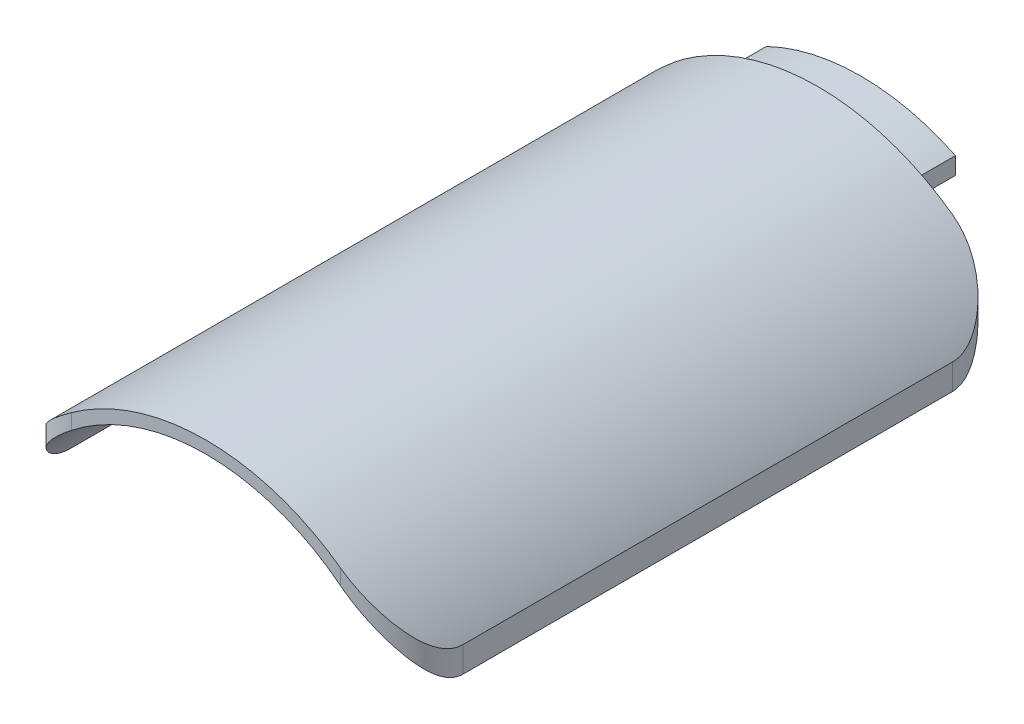
ISO-10303-21;
HEADER;
FILE_DESCRIPTION(('STEP AP214'),'2;1');
FILE_NAME('part.step','',(''),(''),'','','');
FILE_SCHEMA(('AUTOMOTIVE_DESIGN { 1 0 10303 214 1 1 1 1 }'));
ENDSEC;
DATA;
#1=APPLICATION_CONTEXT('core data for automotive mechanical design processes');
#2=APPLICATION_PROTOCOL_DEFINITION('international standard','automotive_design',2000,#1);
#3=PRODUCT_CONTEXT('',#1,'mechanical');
#4=PRODUCT('Part','Part','',(#3));
#5=PRODUCT_RELATED_PRODUCT_CATEGORY('part','',(#4));
#6=PRODUCT_DEFINITION_FORMATION('','',#4);
#7=PRODUCT_DEFINITION_CONTEXT('part definition',#1,'design');
#8=PRODUCT_DEFINITION('design','',#6,#7);
#9=PRODUCT_DEFINITION_SHAPE('','',#8);
#10=(LENGTH_UNIT() NAMED_UNIT(*) SI_UNIT(.MILLI.,.METRE.));
#11=(NAMED_UNIT(*) PLANE_ANGLE_UNIT() SI_UNIT($,.RADIAN.));
#12=(NAMED_UNIT(*) SI_UNIT($,.STERADIAN.) SOLID_ANGLE_UNIT());
#13=UNCERTAINTY_MEASURE_WITH_UNIT(LENGTH_MEASURE(1.E-05),#10,'distance_accuracy_value','');
#14=(GEOMETRIC_REPRESENTATION_CONTEXT(3) GLOBAL_UNCERTAINTY_ASSIGNED_CONTEXT((#13)) GLOBAL_UNIT_ASSIGNED_CONTEXT((#10,
#11,#12)) REPRESENTATION_CONTEXT('',''));
#15=CARTESIAN_POINT('',(0.,0.,0.));
#16=DIRECTION('',(0.,0.,1.));
#17=DIRECTION('',(1.,0.,0.));
#18=AXIS2_PLACEMENT_3D('',#15,#16,#17);
#19=CARTESIAN_POINT('',(0.,0.,375.));
#20=DIRECTION('',(0.,0.,-1.));
#21=DIRECTION('',(-1.,0.,0.));
#22=AXIS2_PLACEMENT_3D('',#19,#20,#21);
#23=CYLINDRICAL_SURFACE('',#22,37.5);
#24=DIRECTION('',(0.,0.,-1.));
#25=VECTOR('',#24,1.);
#26=CARTESIAN_POINT('',(32.,19.5512147960171,375.));
#27=LINE('',#26,#25);
#28=CARTESIAN_POINT('',(32.,19.5512147960171,106.));
#29=VERTEX_POINT('',#28);
#30=CARTESIAN_POINT('',(32.,19.5512147960171,26.));
#31=VERTEX_POINT('',#30);
#32=EDGE_CURVE('E191',#29,#31,#27,.T.);
#33=ORIENTED_EDGE('',*,*,#32,.T.);
#34=CARTESIAN_POINT('',(32.,19.5512147960171,26.));
#35=CARTESIAN_POINT('',(32.0000348606653,19.5511406859725,25.8386052225587));
#36=CARTESIAN_POINT('',(31.9960942535341,19.5576071985785,25.6772548940674));
#37=CARTESIAN_POINT('',(31.9805331520392,19.583051269911,25.3561231325469));
#38=CARTESIAN_POINT('',(31.968922749581,19.6020123881723,25.1963399175093));
#39=CARTESIAN_POINT('',(31.9384813135739,19.6515697083223,24.8813526395979));
#40=CARTESIAN_POINT('',(31.9197413982965,19.6820190466172,24.7261163802708));
#41=CARTESIAN_POINT('',(31.8754646946513,19.7536460253051,24.4190954062567));
#42=CARTESIAN_POINT('',(31.8499253104144,19.7948277629356,24.2673120338695));
#43=CARTESIAN_POINT('',(31.7842201462848,19.9002068748232,23.9245014913258));
#44=CARTESIAN_POINT('',(31.7419605818202,19.9676153626029,23.7348606710974));
#45=CARTESIAN_POINT('',(31.648046999364,20.1161336992894,23.3633431199751));
#46=CARTESIAN_POINT('',(31.5963855319218,20.1972544092065,23.1814726879354));
#47=CARTESIAN_POINT('',(31.4844466779128,20.3713123373272,22.8250439237699));
#48=CARTESIAN_POINT('',(31.4241266687638,20.4643077438852,22.6505276422623));
#49=CARTESIAN_POINT('',(31.2960082281873,20.6597080924699,22.3098310711483));
#50=CARTESIAN_POINT('',(31.2282115846393,20.762110783969,22.1436488024062));
#51=CARTESIAN_POINT('',(31.0411596214151,21.041378965737,21.7174017276407));
#52=CARTESIAN_POINT('',(30.9163316329688,21.2246123216131,21.4639369527733));
#53=CARTESIAN_POINT('',(30.6512580517848,21.605656188603,20.9767852104129));
#54=CARTESIAN_POINT('',(30.511002786363,21.8034758191899,20.7431108155729));
#55=CARTESIAN_POINT('',(30.2165229683374,22.2097905431531,20.2937745601052));
#56=CARTESIAN_POINT('',(30.0622745038168,22.4183036351353,20.0781447906464));
#57=CARTESIAN_POINT('',(29.741203601213,22.8425404415046,19.6642012824933));
#58=CARTESIAN_POINT('',(29.5743824004569,23.0582634451791,19.4658858439701));
#59=CARTESIAN_POINT('',(29.1469523195718,23.5981629886693,18.9953833486541));
#60=CARTESIAN_POINT('',(28.8793964106882,23.9252375210541,18.7327868109242));
#61=CARTESIAN_POINT('',(28.3202795797842,24.5845250716592,18.241616571789));
#62=CARTESIAN_POINT('',(28.0287083181411,24.9167402526255,18.0130576451894));
#63=CARTESIAN_POINT('',(27.4232826277421,25.5815438826687,17.5902383018335));
#64=CARTESIAN_POINT('',(27.109463380802,25.9141309585163,17.3959253549362));
#65=CARTESIAN_POINT('',(26.4602493224489,26.5766861518724,17.0421670380368));
#66=CARTESIAN_POINT('',(26.1248591720081,26.9066548179634,16.8827141681196));
#67=CARTESIAN_POINT('',(25.490143516614,27.5074748434716,16.6236257357688));
#68=CARTESIAN_POINT('',(25.1938714177103,27.7791815159084,16.5184742297731));
#69=CARTESIAN_POINT('',(24.5880635524904,28.3167982924156,16.3355280674058));
#70=CARTESIAN_POINT('',(24.2785322458401,28.5827103007902,16.2577242925699));
#71=CARTESIAN_POINT('',(23.6468917273231,29.1074425593171,16.1312827009771));
#72=CARTESIAN_POINT('',(23.3247664948343,29.3662530134371,16.0826834117591));
#73=CARTESIAN_POINT('',(22.8336750184276,29.7475438042224,16.0334511027046));
#74=CARTESIAN_POINT('',(22.6685651395805,29.8735557669414,16.0209844280461));
#75=CARTESIAN_POINT('',(22.3359859847857,30.1230306201399,16.0042595775438));
#76=CARTESIAN_POINT('',(22.1685163777263,30.2464931467736,16.0000025654507));
#77=CARTESIAN_POINT('',(22.,30.3685692781204,16.));
#78=B_SPLINE_CURVE_WITH_KNOTS('',3,(#34,#35,#36,#37,#38,#39,#40,#41,#42,#43,#44,#45,#46,#47,#48,
#49,#50,#51,#52,#53,#54,#55,#56,#57,#58,#59,#60,#61,#62,#63,#64,#65,#66,#67,#68,#69,#70,#71,#72,
#73,#74,#75,#76,#77),.UNSPECIFIED.,.F.,.F.,(4,2,2,2,2,2,2,2,2,2,2,2,2,2,2,2,2,2,2,2,2,4),(0.,
0.483935807476874,0.967236117867529,1.44455655651209,1.92205948626233,2.53805851832963,
3.15454776952646,3.77418302963144,4.39367043702188,5.40229644344911,6.41155848822273,
7.42257889448323,8.4334999322682,9.92403076524386,11.4152067231809,12.9040750623484,
14.3926227654229,15.6381118942458,16.8831853488944,18.1298977607866,18.7539589927139,
19.3781086811744),.UNSPECIFIED.);
#79=CARTESIAN_POINT('',(22.,30.3685692781204,16.));
#80=VERTEX_POINT('',#79);
#81=EDGE_CURVE('E262',#31,#80,#78,.T.);
#82=ORIENTED_EDGE('',*,*,#81,.T.);
#83=CARTESIAN_POINT('',(0.,0.,16.));
#84=DIRECTION('',(0.,0.,1.));
#85=DIRECTION('',(1.,0.,0.));
#86=AXIS2_PLACEMENT_3D('',#83,#84,#85);
#87=CIRCLE('',#86,37.5);
#88=CARTESIAN_POINT('',(-22.,30.3685692781204,16.));
#89=VERTEX_POINT('',#88);
#90=EDGE_CURVE('E188',#80,#89,#87,.T.);
#91=ORIENTED_EDGE('',*,*,#90,.T.);
#92=CARTESIAN_POINT('',(-22.,30.3685692781204,16.));
#93=CARTESIAN_POINT('',(-22.1721835225826,30.2438367623664,16.0000028145737));
#94=CARTESIAN_POINT('',(-22.343273233468,30.117657347922,16.0044469752308));
#95=CARTESIAN_POINT('',(-22.6829817924161,29.8626424041903,16.0219003638456));
#96=CARTESIAN_POINT('',(-22.85160100365,29.7338072721419,16.0349083197188));
#97=CARTESIAN_POINT('',(-23.3530346536469,29.3439059859976,16.0862657618297));
#98=CARTESIAN_POINT('',(-23.6818068244252,29.079167267938,16.1369502498168));
#99=CARTESIAN_POINT('',(-24.3257690667173,28.54263986711,16.2686797454599));
#100=CARTESIAN_POINT('',(-24.6409900684579,28.2708697866179,16.3496510170919));
#101=CARTESIAN_POINT('',(-25.2575379628479,27.7214234359218,16.5399495337641));
#102=CARTESIAN_POINT('',(-25.5588611146832,27.4437456046101,16.6492843614219));
#103=CARTESIAN_POINT('',(-26.1592581585075,26.8723334747862,16.899948006835));
#104=CARTESIAN_POINT('',(-26.4576720727544,26.5784238818279,17.0424552932412));
#105=CARTESIAN_POINT('',(-27.0373892922903,25.9884707339961,17.3551639111054));
#106=CARTESIAN_POINT('',(-27.3186919450032,25.6924270982171,17.5253662978693));
#107=CARTESIAN_POINT('',(-27.8637995398078,25.1002164029748,17.8929605523654));
#108=CARTESIAN_POINT('',(-28.1275800689398,24.8040497268011,18.0903892231313));
#109=CARTESIAN_POINT('',(-28.636380785587,24.2148522211638,18.5121660757309));
#110=CARTESIAN_POINT('',(-28.8814052345768,23.9218206924726,18.7365081127985));
#111=CARTESIAN_POINT('',(-29.2924847809544,23.4153451606955,19.152930058555));
#112=CARTESIAN_POINT('',(-29.462899994332,23.2004233636663,19.33892951735));
#113=CARTESIAN_POINT('',(-29.792040466365,22.7762232190913,19.7271309611902));
#114=CARTESIAN_POINT('',(-29.9507649177993,22.5669452618714,19.9293340630521));
#115=CARTESIAN_POINT('',(-30.2553452833126,22.1569219083094,20.3505126820212));
#116=CARTESIAN_POINT('',(-30.401223121708,21.9561622902939,20.5694583836154));
#117=CARTESIAN_POINT('',(-30.679104948441,21.5661713210999,21.025620038565));
#118=CARTESIAN_POINT('',(-30.8111153622652,21.3769346479903,21.262827441262));
#119=CARTESIAN_POINT('',(-31.0134853770194,21.0815778934021,21.6655603529876));
#120=CARTESIAN_POINT('',(-31.0885855896759,20.9706079567822,21.8251403388256));
#121=CARTESIAN_POINT('',(-31.2319167481295,20.756541339428,22.1524414393715));
#122=CARTESIAN_POINT('',(-31.3001461404199,20.6534464405226,22.3201643825703));
#123=CARTESIAN_POINT('',(-31.4932689462162,20.3587518313208,22.8358021905933));
#124=CARTESIAN_POINT('',(-31.6069064242812,20.1812858759839,23.1967875628449));
#125=CARTESIAN_POINT('',(-31.7377290341667,19.9742673664052,23.7197755801866));
#126=CARTESIAN_POINT('',(-31.7713972129195,19.920633886837,23.8684444663621));
#127=CARTESIAN_POINT('',(-31.8323653599278,19.8230623002211,24.1701803904557));
#128=CARTESIAN_POINT('',(-31.8596686033829,19.7791192074308,24.3232451206606));
#129=CARTESIAN_POINT('',(-31.9073323154914,19.7021370258921,24.6327977891897));
#130=CARTESIAN_POINT('',(-31.9277078696306,19.6690742496716,24.7892774895195));
#131=CARTESIAN_POINT('',(-31.9611300409407,19.614718724795,25.1049859170745));
#132=CARTESIAN_POINT('',(-31.9741809981529,19.5934190062976,25.2642129586402));
#133=CARTESIAN_POINT('',(-31.9889231944308,19.5693357210882,25.5198015420708));
#134=CARTESIAN_POINT('',(-31.9930724630663,19.5625499629917,25.6156645677162));
#135=CARTESIAN_POINT('',(-31.9986125214682,19.5534857875933,25.8076800079534));
#136=CARTESIAN_POINT('',(-32.0000033813456,19.5512072557307,25.9038324151278));
#137=CARTESIAN_POINT('',(-32.,19.5512147960172,26.));
#138=B_SPLINE_CURVE_WITH_KNOTS('',3,(#92,#93,#94,#95,#96,#97,#98,#99,#100,#101,#102,#103,#104,
#105,#106,#107,#108,#109,#110,#111,#112,#113,#114,#115,#116,#117,#118,#119,#120,#121,#122,#123,
#124,#125,#126,#127,#128,#129,#130,#131,#132,#133,#134,#135,#136,#137),.UNSPECIFIED.,.F.,.F.,(4,
2,2,2,2,2,2,2,2,2,2,2,2,2,2,2,2,2,2,2,2,2,4),(0.,0.637726243830515,1.27535777980772,
2.54921126487554,3.81998340893068,5.09109562765375,6.41714094110986,7.74323679460103,
9.07114309233862,10.3987467820907,11.3923883557669,12.3860984740029,13.3780784380731,
14.3695967206994,14.9943092855507,15.6191627835429,16.8664385755126,17.3508631641748,
17.8350379299232,18.3181515185684,18.8009785450163,19.0894225796041,19.3778592826748),.UNSPECIFIED.);
#139=CARTESIAN_POINT('',(-32.,19.5512147960172,26.));
#140=VERTEX_POINT('',#139);
#141=EDGE_CURVE('E302',#89,#140,#138,.T.);
#142=ORIENTED_EDGE('',*,*,#141,.T.);
#143=DIRECTION('',(0.,0.,-1.));
#144=VECTOR('',#143,1.);
#145=CARTESIAN_POINT('',(-32.,19.5512147960172,375.));
#146=LINE('',#145,#144);
#147=CARTESIAN_POINT('',(-32.,19.5512147960172,106.));
#148=VERTEX_POINT('',#147);
#149=EDGE_CURVE('E194',#140,#148,#146,.F.);
#150=ORIENTED_EDGE('',*,*,#149,.T.);
#151=CARTESIAN_POINT('',(-32.,19.5512147960172,106.));
#152=CARTESIAN_POINT('',(-32.0000348606653,19.5511406859726,106.161394777441));
#153=CARTESIAN_POINT('',(-31.9960942535341,19.5576071985785,106.322745105933));
#154=CARTESIAN_POINT('',(-31.9805331520392,19.583051269911,106.643876867453));
#155=CARTESIAN_POINT('',(-31.968922749581,19.6020123881724,106.803660082491));
#156=CARTESIAN_POINT('',(-31.9384813135738,19.6515697083223,107.118647360402));
#157=CARTESIAN_POINT('',(-31.9197413982965,19.6820190466172,107.273883619729));
#158=CARTESIAN_POINT('',(-31.8754646946513,19.7536460253051,107.580904593743));
#159=CARTESIAN_POINT('',(-31.8499253104144,19.7948277629356,107.73268796613));
#160=CARTESIAN_POINT('',(-31.7842201462848,19.9002068748232,108.075498508674));
#161=CARTESIAN_POINT('',(-31.7419605818202,19.9676153626029,108.265139328903));
#162=CARTESIAN_POINT('',(-31.648046999364,20.1161336992894,108.636656880025));
#163=CARTESIAN_POINT('',(-31.5963855319217,20.1972544092065,108.818527312065));
#164=CARTESIAN_POINT('',(-31.4844466779128,20.3713123373272,109.17495607623));
#165=CARTESIAN_POINT('',(-31.4241266687638,20.4643077438852,109.349472357738));
#166=CARTESIAN_POINT('',(-31.2960082281873,20.6597080924699,109.690168928852));
#167=CARTESIAN_POINT('',(-31.2282115846392,20.7621107839691,109.856351197594));
#168=CARTESIAN_POINT('',(-31.0411596214151,21.041378965737,110.282598272359));
#169=CARTESIAN_POINT('',(-30.9163316329687,21.2246123216131,110.536063047227));
#170=CARTESIAN_POINT('',(-30.6512580517848,21.6056561886031,111.023214789587));
#171=CARTESIAN_POINT('',(-30.5110027863629,21.80347581919,111.256889184427));
#172=CARTESIAN_POINT('',(-30.2165229683373,22.2097905431531,111.706225439895));
#173=CARTESIAN_POINT('',(-30.0622745038168,22.4183036351353,111.921855209354));
#174=CARTESIAN_POINT('',(-29.741203601213,22.8425404415046,112.335798717507));
#175=CARTESIAN_POINT('',(-29.5743824004569,23.0582634451791,112.53411415603));
#176=CARTESIAN_POINT('',(-29.1469523195717,23.5981629886694,113.004616651346));
#177=CARTESIAN_POINT('',(-28.8793964106882,23.9252375210542,113.267213189076));
#178=CARTESIAN_POINT('',(-28.3202795797841,24.5845250716592,113.758383428211));
#179=CARTESIAN_POINT('',(-28.0287083181411,24.9167402526255,113.986942354811));
#180=CARTESIAN_POINT('',(-27.423282627742,25.5815438826688,114.409761698167));
#181=CARTESIAN_POINT('',(-27.109463380802,25.9141309585164,114.604074645064));
#182=CARTESIAN_POINT('',(-26.4602493224488,26.5766861518725,114.957832961963));
#183=CARTESIAN_POINT('',(-26.124859172008,26.9066548179635,115.11728583188));
#184=CARTESIAN_POINT('',(-25.490143516614,27.5074748434717,115.376374264231));
#185=CARTESIAN_POINT('',(-25.1938714177103,27.7791815159084,115.481525770227));
#186=CARTESIAN_POINT('',(-24.5880635524904,28.3167982924156,115.664471932594));
#187=CARTESIAN_POINT('',(-24.27853224584,28.5827103007902,115.74227570743));
#188=CARTESIAN_POINT('',(-23.646891727323,29.1074425593171,115.868717299023));
#189=CARTESIAN_POINT('',(-23.3247664948343,29.3662530134371,115.917316588241));
#190=CARTESIAN_POINT('',(-22.8336750184276,29.7475438042224,115.966548897295));
#191=CARTESIAN_POINT('',(-22.6685651395805,29.8735557669414,115.979015571954));
#192=CARTESIAN_POINT('',(-22.3359859847857,30.1230306201399,115.995740422456));
#193=CARTESIAN_POINT('',(-22.1685163777263,30.2464931467736,115.999997434549));
#194=CARTESIAN_POINT('',(-22.,30.3685692781204,116.));
#195=B_SPLINE_CURVE_WITH_KNOTS('',3,(#151,#152,#153,#154,#155,#156,#157,#158,#159,#160,#161,
#162,#163,#164,#165,#166,#167,#168,#169,#170,#171,#172,#173,#174,#175,#176,#177,#178,#179,#180,
#181,#182,#183,#184,#185,#186,#187,#188,#189,#190,#191,#192,#193,#194),.UNSPECIFIED.,.F.,.F.,(4,
2,2,2,2,2,2,2,2,2,2,2,2,2,2,2,2,2,2,2,2,4),(0.,0.483935807476907,0.967236117867538,
1.44455655651207,1.92205948626233,2.53805851832963,3.15454776952646,3.77418302963145,
4.39367043702188,5.40229644344913,6.41155848822275,7.42257889448326,8.43349993226823,
9.92403076524388,11.415206723181,12.9040750623485,14.3926227654229,15.6381118942458,
16.8831853488944,18.1298977607866,18.7539589927139,19.3781086811744),.UNSPECIFIED.);
#196=CARTESIAN_POINT('',(-22.,30.3685692781204,116.));
#197=VERTEX_POINT('',#196);
#198=EDGE_CURVE('E263',#148,#197,#195,.T.);
#199=ORIENTED_EDGE('',*,*,#198,.T.);
#200=CARTESIAN_POINT('',(0.,0.,116.));
#201=DIRECTION('',(0.,0.,-1.));
#202=DIRECTION('',(-1.,0.,0.));
#203=AXIS2_PLACEMENT_3D('',#200,#201,#202);
#204=CIRCLE('',#203,37.5);
#205=CARTESIAN_POINT('',(22.,30.3685692781204,116.));
#206=VERTEX_POINT('',#205);
#207=EDGE_CURVE('E192',#197,#206,#204,.T.);
#208=ORIENTED_EDGE('',*,*,#207,.T.);
#209=CARTESIAN_POINT('',(22.,30.3685692781204,116.));
#210=CARTESIAN_POINT('',(22.1721835225826,30.2438367623664,115.999997185426));
#211=CARTESIAN_POINT('',(22.343273233468,30.117657347922,115.995553024769));
#212=CARTESIAN_POINT('',(22.6829817924161,29.8626424041903,115.978099636154));
#213=CARTESIAN_POINT('',(22.8516010036501,29.7338072721418,115.965091680281));
#214=CARTESIAN_POINT('',(23.3530346536469,29.3439059859976,115.91373423817));
#215=CARTESIAN_POINT('',(23.6818068244252,29.079167267938,115.863049750183));
#216=CARTESIAN_POINT('',(24.3257690667173,28.54263986711,115.73132025454));
#217=CARTESIAN_POINT('',(24.640990068458,28.2708697866179,115.650348982908));
#218=CARTESIAN_POINT('',(25.2575379628479,27.7214234359218,115.460050466236));
#219=CARTESIAN_POINT('',(25.5588611146832,27.44374560461,115.350715638578));
#220=CARTESIAN_POINT('',(26.1592581585075,26.8723334747862,115.100051993165));
#221=CARTESIAN_POINT('',(26.4576720727544,26.5784238818279,114.957544706759));
#222=CARTESIAN_POINT('',(27.0373892922903,25.9884707339961,114.644836088895));
#223=CARTESIAN_POINT('',(27.3186919450032,25.6924270982171,114.474633702131));
#224=CARTESIAN_POINT('',(27.8637995398078,25.1002164029748,114.107039447635));
#225=CARTESIAN_POINT('',(28.1275800689398,24.8040497268011,113.909610776869));
#226=CARTESIAN_POINT('',(28.636380785587,24.2148522211638,113.487833924269));
#227=CARTESIAN_POINT('',(28.8814052345768,23.9218206924726,113.263491887202));
#228=CARTESIAN_POINT('',(29.2924847809545,23.4153451606955,112.847069941445));
#229=CARTESIAN_POINT('',(29.462899994332,23.2004233636663,112.66107048265));
#230=CARTESIAN_POINT('',(29.792040466365,22.7762232190913,112.27286903881));
#231=CARTESIAN_POINT('',(29.9507649177993,22.5669452618713,112.070665936948));
#232=CARTESIAN_POINT('',(30.2553452833126,22.1569219083094,111.649487317979));
#233=CARTESIAN_POINT('',(30.401223121708,21.9561622902938,111.430541616385));
#234=CARTESIAN_POINT('',(30.679104948441,21.5661713210999,110.974379961435));
#235=CARTESIAN_POINT('',(30.8111153622652,21.3769346479902,110.737172558738));
#236=CARTESIAN_POINT('',(31.0134853770194,21.0815778934021,110.334439647012));
#237=CARTESIAN_POINT('',(31.0885855896759,20.9706079567822,110.174859661174));
#238=CARTESIAN_POINT('',(31.2319167481295,20.756541339428,109.847558560628));
#239=CARTESIAN_POINT('',(31.3001461404199,20.6534464405226,109.67983561743));
#240=CARTESIAN_POINT('',(31.4932689462162,20.3587518313207,109.164197809407));
#241=CARTESIAN_POINT('',(31.6069064242812,20.1812858759839,108.803212437155));
#242=CARTESIAN_POINT('',(31.7377290341667,19.9742673664051,108.280224419813));
#243=CARTESIAN_POINT('',(31.7713972129195,19.920633886837,108.131555533638));
#244=CARTESIAN_POINT('',(31.8323653599279,19.8230623002211,107.829819609544));
#245=CARTESIAN_POINT('',(31.859668603383,19.7791192074308,107.676754879339));
#246=CARTESIAN_POINT('',(31.9073323154914,19.7021370258921,107.36720221081));
#247=CARTESIAN_POINT('',(31.9277078696306,19.6690742496716,107.210722510481));
#248=CARTESIAN_POINT('',(31.9611300409407,19.614718724795,106.895014082925));
#249=CARTESIAN_POINT('',(31.9741809981529,19.5934190062975,106.73578704136));
#250=CARTESIAN_POINT('',(31.9889231944308,19.5693357210882,106.480198457929));
#251=CARTESIAN_POINT('',(31.9930724630663,19.5625499629916,106.384335432284));
#252=CARTESIAN_POINT('',(31.9986125214683,19.5534857875932,106.192319992047));
#253=CARTESIAN_POINT('',(32.0000033813456,19.5512072557306,106.096167584872));
#254=CARTESIAN_POINT('',(32.,19.5512147960171,106.));
#255=B_SPLINE_CURVE_WITH_KNOTS('',3,(#209,#210,#211,#212,#213,#214,#215,#216,#217,#218,#219,
#220,#221,#222,#223,#224,#225,#226,#227,#228,#229,#230,#231,#232,#233,#234,#235,#236,#237,#238,
#239,#240,#241,#242,#243,#244,#245,#246,#247,#248,#249,#250,#251,#252,#253,#254),.UNSPECIFIED.,
.F.,.F.,(4,2,2,2,2,2,2,2,2,2,2,2,2,2,2,2,2,2,2,2,2,2,4),(0.,0.637726243830516,1.27535777980772,
2.54921126487555,3.81998340893068,5.09109562765375,6.41714094110986,7.74323679460103,
9.07114309233862,10.3987467820907,11.3923883557669,12.3860984740029,13.3780784380731,
14.3695967206994,14.9943092855507,15.6191627835429,16.8664385755126,17.3508631641748,
17.8350379299232,18.3181515185684,18.8009785450163,19.0894225796041,19.3778592826749),.UNSPECIFIED.);
#256=EDGE_CURVE('E255',#206,#29,#255,.T.);
#257=ORIENTED_EDGE('',*,*,#256,.T.);
#258=EDGE_LOOP('',(#33,#82,#91,#142,#150,#199,#208,#257));
#259=FACE_BOUND('',#258,.T.);
#260=ADVANCED_FACE('F33',(#259),#23,.T.);
#261=CARTESIAN_POINT('',(-32.,49.0499971602689,16.));
#262=DIRECTION('',(1.,0.,0.));
#263=DIRECTION('',(0.,0.,-1.));
#264=AXIS2_PLACEMENT_3D('',#261,#262,#263);
#265=PLANE('',#264);
#266=DIRECTION('',(0.,0.,-1.));
#267=VECTOR('',#266,1.);
#268=CARTESIAN_POINT('',(-32.,15.3704261489395,375.));
#269=LINE('',#268,#267);
#270=CARTESIAN_POINT('',(-32.,15.3704261489395,26.));
#271=VERTEX_POINT('',#270);
#272=CARTESIAN_POINT('',(-32.,15.3704261489395,106.));
#273=VERTEX_POINT('',#272);
#274=EDGE_CURVE('E185',#271,#273,#269,.F.);
#275=ORIENTED_EDGE('',*,*,#274,.T.);
#276=DIRECTION('',(0.,-1.,0.));
#277=VECTOR('',#276,1.);
#278=CARTESIAN_POINT('',(-32.,49.0499971602689,106.));
#279=LINE('',#278,#277);
#280=EDGE_CURVE('E11',#273,#148,#279,.F.);
#281=ORIENTED_EDGE('',*,*,#280,.T.);
#282=ORIENTED_EDGE('',*,*,#149,.F.);
#283=DIRECTION('',(0.,-1.,0.));
#284=VECTOR('',#283,1.);
#285=CARTESIAN_POINT('',(-32.,49.0499971602689,26.));
#286=LINE('',#285,#284);
#287=EDGE_CURVE('E42',#140,#271,#286,.T.);
#288=ORIENTED_EDGE('',*,*,#287,.T.);
#289=EDGE_LOOP('',(#275,#281,#282,#288));
#290=FACE_BOUND('',#289,.T.);
#291=ADVANCED_FACE('F226',(#290),#265,.F.);
#292=CARTESIAN_POINT('',(-32.,49.0499971602689,116.));
#293=DIRECTION('',(0.,0.,-1.));
#294=DIRECTION('',(-1.,0.,0.));
#295=AXIS2_PLACEMENT_3D('',#292,#293,#294);
#296=PLANE('',#295);
#297=CARTESIAN_POINT('',(0.,0.,116.));
#298=DIRECTION('',(0.,0.,-1.));
#299=DIRECTION('',(-1.,0.,0.));
#300=AXIS2_PLACEMENT_3D('',#297,#298,#299);
#301=CIRCLE('',#300,35.5);
#302=CARTESIAN_POINT('',(-22.,27.8612634315101,116.));
#303=VERTEX_POINT('',#302);
#304=CARTESIAN_POINT('',(22.,27.8612634315101,116.));
#305=VERTEX_POINT('',#304);
#306=EDGE_CURVE('E183',#303,#305,#301,.T.);
#307=ORIENTED_EDGE('',*,*,#306,.T.);
#308=DIRECTION('',(0.,-1.,0.));
#309=VECTOR('',#308,1.);
#310=CARTESIAN_POINT('',(22.,49.0499971602689,116.));
#311=LINE('',#310,#309);
#312=EDGE_CURVE('E57',#305,#206,#311,.F.);
#313=ORIENTED_EDGE('',*,*,#312,.T.);
#314=ORIENTED_EDGE('',*,*,#207,.F.);
#315=DIRECTION('',(0.,-1.,0.));
#316=VECTOR('',#315,1.);
#317=CARTESIAN_POINT('',(-22.,49.0499971602689,116.));
#318=LINE('',#317,#316);
#319=EDGE_CURVE('E274',#197,#303,#318,.T.);
#320=ORIENTED_EDGE('',*,*,#319,.T.);
#321=EDGE_LOOP('',(#307,#313,#314,#320));
#322=FACE_BOUND('',#321,.T.);
#323=ADVANCED_FACE('F292',(#322),#296,.F.);
#324=CARTESIAN_POINT('',(32.,49.0499971602689,16.));
#325=DIRECTION('',(-1.,0.,0.));
#326=DIRECTION('',(0.,0.,1.));
#327=AXIS2_PLACEMENT_3D('',#324,#325,#326);
#328=PLANE('',#327);
#329=DIRECTION('',(0.,0.,-1.));
#330=VECTOR('',#329,1.);
#331=CARTESIAN_POINT('',(32.,15.3704261489393,375.));
#332=LINE('',#331,#330);
#333=CARTESIAN_POINT('',(32.,15.3704261489393,106.));
#334=VERTEX_POINT('',#333);
#335=CARTESIAN_POINT('',(32.,15.3704261489393,26.));
#336=VERTEX_POINT('',#335);
#337=EDGE_CURVE('E180',#334,#336,#332,.T.);
#338=ORIENTED_EDGE('',*,*,#337,.T.);
#339=DIRECTION('',(0.,-1.,0.));
#340=VECTOR('',#339,1.);
#341=CARTESIAN_POINT('',(32.,49.0499971602689,26.));
#342=LINE('',#341,#340);
#343=EDGE_CURVE('E301',#336,#31,#342,.F.);
#344=ORIENTED_EDGE('',*,*,#343,.T.);
#345=ORIENTED_EDGE('',*,*,#32,.F.);
#346=DIRECTION('',(0.,-1.,0.));
#347=VECTOR('',#346,1.);
#348=CARTESIAN_POINT('',(32.,49.0499971602689,106.));
#349=LINE('',#348,#347);
#350=EDGE_CURVE('E298',#29,#334,#349,.T.);
#351=ORIENTED_EDGE('',*,*,#350,.T.);
#352=EDGE_LOOP('',(#338,#344,#345,#351));
#353=FACE_BOUND('',#352,.T.);
#354=ADVANCED_FACE('F320',(#353),#328,.F.);
#355=CARTESIAN_POINT('',(-32.,49.0499971602689,16.));
#356=DIRECTION('',(0.,0.,1.));
#357=DIRECTION('',(1.,0.,0.));
#358=AXIS2_PLACEMENT_3D('',#355,#356,#357);
#359=PLANE('',#358);
#360=ORIENTED_EDGE('',*,*,#90,.F.);
#361=DIRECTION('',(0.,-1.,0.));
#362=VECTOR('',#361,1.);
#363=CARTESIAN_POINT('',(22.,49.0499971602689,16.));
#364=LINE('',#363,#362);
#365=CARTESIAN_POINT('',(22.,27.8612634315101,16.));
#366=VERTEX_POINT('',#365);
#367=EDGE_CURVE('E201',#80,#366,#364,.T.);
#368=ORIENTED_EDGE('',*,*,#367,.T.);
#369=CARTESIAN_POINT('',(0.,0.,16.));
#370=DIRECTION('',(0.,0.,1.));
#371=DIRECTION('',(1.,0.,0.));
#372=AXIS2_PLACEMENT_3D('',#369,#370,#371);
#373=CIRCLE('',#372,35.5);
#374=CARTESIAN_POINT('',(15.4507042253521,31.9613162892376,16.));
#375=VERTEX_POINT('',#374);
#376=EDGE_CURVE('E177',#366,#375,#373,.T.);
#377=ORIENTED_EDGE('',*,*,#376,.T.);
#378=CARTESIAN_POINT('',(-15.4507042253521,31.9613162892376,16.));
#379=VERTEX_POINT('',#378);
#380=EDGE_CURVE('E137',#375,#379,#373,.T.);
#381=ORIENTED_EDGE('',*,*,#380,.T.);
#382=CARTESIAN_POINT('',(-22.,27.8612634315101,16.));
#383=VERTEX_POINT('',#382);
#384=EDGE_CURVE('E172',#379,#383,#373,.T.);
#385=ORIENTED_EDGE('',*,*,#384,.T.);
#386=DIRECTION('',(0.,-1.,0.));
#387=VECTOR('',#386,1.);
#388=CARTESIAN_POINT('',(-22.,49.0499971602689,16.));
#389=LINE('',#388,#387);
#390=EDGE_CURVE('E199',#383,#89,#389,.F.);
#391=ORIENTED_EDGE('',*,*,#390,.T.);
#392=EDGE_LOOP('',(#360,#368,#377,#381,#385,#391));
#393=FACE_BOUND('',#392,.T.);
#394=ADVANCED_FACE('F224',(#393),#359,.F.);
#395=CARTESIAN_POINT('',(0.,0.,375.));
#396=DIRECTION('',(0.,0.,-1.));
#397=DIRECTION('',(-1.,0.,0.));
#398=AXIS2_PLACEMENT_3D('',#395,#396,#397);
#399=CYLINDRICAL_SURFACE('',#398,35.5);
#400=DIRECTION('',(0.,0.,-1.));
#401=VECTOR('',#400,1.);
#402=CARTESIAN_POINT('',(-15.4507042253521,31.9613162892376,26.));
#403=LINE('',#402,#401);
#404=CARTESIAN_POINT('',(-15.4507042253521,31.9613162892376,26.));
#405=VERTEX_POINT('',#404);
#406=EDGE_CURVE('E169',#405,#379,#403,.T.);
#407=ORIENTED_EDGE('',*,*,#406,.F.);
#408=CARTESIAN_POINT('',(0.,0.,26.));
#409=DIRECTION('',(0.,0.,-1.));
#410=DIRECTION('',(-1.,0.,0.));
#411=AXIS2_PLACEMENT_3D('',#408,#409,#410);
#412=CIRCLE('',#411,35.5);
#413=CARTESIAN_POINT('',(15.4507042253521,31.9613162892376,26.));
#414=VERTEX_POINT('',#413);
#415=EDGE_CURVE('E160',#405,#414,#412,.T.);
#416=ORIENTED_EDGE('',*,*,#415,.T.);
#417=DIRECTION('',(0.,0.,-1.));
#418=VECTOR('',#417,1.);
#419=CARTESIAN_POINT('',(15.4507042253521,31.9613162892376,26.));
#420=LINE('',#419,#418);
#421=EDGE_CURVE('E140',#414,#375,#420,.T.);
#422=ORIENTED_EDGE('',*,*,#421,.T.);
#423=ORIENTED_EDGE('',*,*,#376,.F.);
#424=CARTESIAN_POINT('',(22.,27.8612634315101,16.));
#425=CARTESIAN_POINT('',(22.1666831888699,27.7296487346537,16.0000027896799));
#426=CARTESIAN_POINT('',(22.3321552764037,27.5965557973289,16.0041673165007));
#427=CARTESIAN_POINT('',(22.660428695313,27.3276409428737,16.0204784424211));
#428=CARTESIAN_POINT('',(22.8232304249814,27.1918194395668,16.0326238398437));
#429=CARTESIAN_POINT('',(23.3069627876999,26.7808568642454,16.0804848035078));
#430=CARTESIAN_POINT('',(23.6236030590327,26.5019155751496,16.127626726896));
#431=CARTESIAN_POINT('',(24.2424681816365,25.9369938918665,16.2495932828076));
#432=CARTESIAN_POINT('',(24.5447470454758,25.6510472303444,16.3243030723107));
#433=CARTESIAN_POINT('',(25.1354044164327,25.0725424567189,16.4992561889538));
#434=CARTESIAN_POINT('',(25.4237786595194,24.7799823564132,16.5995072901817));
#435=CARTESIAN_POINT('',(26.0163224077401,24.1579165574794,16.8358495054702));
#436=CARTESIAN_POINT('',(26.3188154546903,23.8278437609372,16.9746477022635));
#437=CARTESIAN_POINT('',(26.9051627226365,23.1637315157296,17.2794168029222));
#438=CARTESIAN_POINT('',(27.1890159521051,22.829691857165,17.4453891506527));
#439=CARTESIAN_POINT('',(27.7383302256055,22.1590472115844,17.8036972552492));
#440=CARTESIAN_POINT('',(28.0037444004676,21.8224379396922,17.9960967411494));
#441=CARTESIAN_POINT('',(28.515004183523,21.1500074009678,18.4064376340924));
#442=CARTESIAN_POINT('',(28.7608532457858,20.8141860052473,18.6243745158334));
#443=CARTESIAN_POINT('',(29.1839418859974,20.2151665542345,19.0387037444271));
#444=CARTESIAN_POINT('',(29.3648855856793,19.9512521291137,19.2302930385192));
#445=CARTESIAN_POINT('',(29.7137876584401,19.427807886386,19.630695841576));
#446=CARTESIAN_POINT('',(29.8817440830947,19.1682787312288,19.8395119253258));
#447=CARTESIAN_POINT('',(30.2035808797337,18.6570266219414,20.2751054035127));
#448=CARTESIAN_POINT('',(30.3574977498893,18.4052846206415,20.5018331898134));
#449=CARTESIAN_POINT('',(30.6506337639633,17.9128635871457,20.9756451361964));
#450=CARTESIAN_POINT('',(30.7898617181727,17.6721779728997,21.2227169339305));
#451=CARTESIAN_POINT('',(31.0525150995041,17.2064749357855,21.741266740541));
#452=CARTESIAN_POINT('',(31.1758836792405,16.9815151272617,22.0128269187569));
#453=CARTESIAN_POINT('',(31.346344537337,16.6634719508291,22.4405996822026));
#454=CARTESIAN_POINT('',(31.4007534420275,16.5606495521444,22.586664447564));
#455=CARTESIAN_POINT('',(31.5041193226131,16.3631561584984,22.8860247927664));
#456=CARTESIAN_POINT('',(31.5530764146022,16.2684849899699,23.0393202185346));
#457=CARTESIAN_POINT('',(31.6761930827615,16.0280175569122,23.4609015314004));
#458=CARTESIAN_POINT('',(31.7447906768159,15.8913483292718,23.7363571492221));
#459=CARTESIAN_POINT('',(31.8312051862527,15.7171447004549,24.1646456930321));
#460=CARTESIAN_POINT('',(31.8572334722718,15.6642724663131,24.3096732596203));
#461=CARTESIAN_POINT('',(31.9032578770052,15.570319622075,24.6043938762416));
#462=CARTESIAN_POINT('',(31.9232570663208,15.5292330101142,24.7540845083822));
#463=CARTESIAN_POINT('',(31.9595580719158,15.4544076678428,25.0838904466498));
#464=CARTESIAN_POINT('',(31.9746002563314,15.4232133307665,25.2647455560489));
#465=CARTESIAN_POINT('',(31.9897749107537,15.3916998204826,25.538637562767));
#466=CARTESIAN_POINT('',(31.9936019561523,15.3837409657222,25.6306522935198));
#467=CARTESIAN_POINT('',(31.9987168614551,15.3730978243647,25.8151019962552));
#468=CARTESIAN_POINT('',(32.0000034483117,15.3704161822311,25.9075371556771));
#469=CARTESIAN_POINT('',(32.,15.3704261489394,26.));
#470=B_SPLINE_CURVE_WITH_KNOTS('',3,(#424,#425,#426,#427,#428,#429,#430,#431,#432,#433,#434,
#435,#436,#437,#438,#439,#440,#441,#442,#443,#444,#445,#446,#447,#448,#449,#450,#451,#452,#453,
#454,#455,#456,#457,#458,#459,#460,#461,#462,#463,#464,#465,#466,#467,#468,#469),.UNSPECIFIED.,
.F.,.F.,(4,2,2,2,2,2,2,2,2,2,2,2,2,2,2,2,2,2,2,2,2,2,4),(0.,0.637032725717632,1.27396955560601,
2.5463853880247,3.81355931810714,5.08111940357937,6.48608587094644,7.89112701372617,
9.29961792760649,10.7078596291155,11.8261509759006,12.9446097708734,14.0600727362454,
15.1748628063096,16.2935435439416,16.8533743193529,17.4131931711259,18.3545249726155,
18.8236384314092,19.2925125668727,19.8434447783991,20.1205937720047,20.397881612376),.UNSPECIFIED.);
#471=EDGE_CURVE('E240',#366,#336,#470,.T.);
#472=ORIENTED_EDGE('',*,*,#471,.T.);
#473=ORIENTED_EDGE('',*,*,#337,.F.);
#474=CARTESIAN_POINT('',(32.,15.3704261489393,106.));
#475=CARTESIAN_POINT('',(32.000029500663,15.3703477193768,106.138902154464));
#476=CARTESIAN_POINT('',(31.9971071818547,15.3764485926177,106.27775599099));
#477=CARTESIAN_POINT('',(31.985590152275,15.4004005217889,106.55399385792));
#478=CARTESIAN_POINT('',(31.9770044944185,15.418232824768,106.691379879057));
#479=CARTESIAN_POINT('',(31.9545538589085,15.464704987761,106.961794048443));
#480=CARTESIAN_POINT('',(31.9407668504337,15.4931851798638,107.094856473667));
#481=CARTESIAN_POINT('',(31.9082634413131,15.5600164410506,107.357896364305));
#482=CARTESIAN_POINT('',(31.8895448284182,15.5983719398836,107.487872416618));
#483=CARTESIAN_POINT('',(31.8408323968553,15.6976221763029,107.785345608106));
#484=CARTESIAN_POINT('',(31.8091483839173,15.7617988063344,107.95147198054));
#485=CARTESIAN_POINT('',(31.7388015087059,15.9029775933592,108.276725633365));
#486=CARTESIAN_POINT('',(31.7001325779834,15.9799908982383,108.435846676876));
#487=CARTESIAN_POINT('',(31.61642777422,16.1449711306252,108.747829353847));
#488=CARTESIAN_POINT('',(31.5713542576191,16.2330024241664,108.900646544107));
#489=CARTESIAN_POINT('',(31.4757594623546,16.4175940723934,109.199145169326));
#490=CARTESIAN_POINT('',(31.4252394968817,16.5141523701265,109.344828312107));
#491=CARTESIAN_POINT('',(31.2771304450567,16.7938161771595,109.742913065247));
#492=CARTESIAN_POINT('',(31.1740975924452,16.9846062164912,109.987906634623));
#493=CARTESIAN_POINT('',(30.9546461874769,17.3813536361377,110.45890631302));
#494=CARTESIAN_POINT('',(30.8382168025453,17.5873232417413,110.684896796753));
#495=CARTESIAN_POINT('',(30.5932567318214,18.0100651407444,111.120394147904));
#496=CARTESIAN_POINT('',(30.4647040918502,18.2268566842894,111.329869798745));
#497=CARTESIAN_POINT('',(30.1966470234618,18.6675938584919,111.733555485442));
#498=CARTESIAN_POINT('',(30.0571445670283,18.8915381966935,111.927768257483));
#499=CARTESIAN_POINT('',(29.7896643488742,19.3100469381508,112.273868459509));
#500=CARTESIAN_POINT('',(29.6631377319072,19.5039283298865,112.427713113326));
#501=CARTESIAN_POINT('',(29.4028408242845,19.8941703198344,112.725852568393));
#502=CARTESIAN_POINT('',(29.2690696916388,20.0905312041818,112.870146255239));
#503=CARTESIAN_POINT('',(28.85703591567,20.6821722594634,113.289364502803));
#504=CARTESIAN_POINT('',(28.5681224677101,21.0799012605031,113.550536950061));
#505=CARTESIAN_POINT('',(27.9634558269888,21.8756647965951,114.036622709339));
#506=CARTESIAN_POINT('',(27.6477485495937,22.2736976952588,114.261596211233));
#507=CARTESIAN_POINT('',(26.9896813590819,23.0666954770452,114.67490534484));
#508=CARTESIAN_POINT('',(26.647326568704,23.4616609338781,114.863247994259));
#509=CARTESIAN_POINT('',(25.9733544889717,24.2045418064059,115.183511168892));
#510=CARTESIAN_POINT('',(25.6442697030741,24.5531094986515,115.31924693602));
#511=CARTESIAN_POINT('',(24.9662543344819,25.2422201688516,115.556689384151));
#512=CARTESIAN_POINT('',(24.617332243839,25.5827664936382,115.658410499876));
#513=CARTESIAN_POINT('',(23.8999658199068,26.2542066915817,115.824762204491));
#514=CARTESIAN_POINT('',(23.5314769955251,26.5850756600165,115.889303932084));
#515=CARTESIAN_POINT('',(22.9662506402812,27.0714489766436,115.955019631743));
#516=CARTESIAN_POINT('',(22.7755992132764,27.2320451928802,115.971742965548));
#517=CARTESIAN_POINT('',(22.390527820556,27.549529892094,115.994231784872));
#518=CARTESIAN_POINT('',(22.1961069726066,27.706417487525,115.999994673042));
#519=CARTESIAN_POINT('',(22.,27.8612634315101,116.));
#520=B_SPLINE_CURVE_WITH_KNOTS('',3,(#474,#475,#476,#477,#478,#479,#480,#481,#482,#483,#484,
#485,#486,#487,#488,#489,#490,#491,#492,#493,#494,#495,#496,#497,#498,#499,#500,#501,#502,#503,
#504,#505,#506,#507,#508,#509,#510,#511,#512,#513,#514,#515,#516,#517,#518,#519),.UNSPECIFIED.,
.F.,.F.,(4,2,2,2,2,2,2,2,2,2,2,2,2,2,2,2,2,2,2,2,2,2,4),(0.,0.416464700743589,0.832265285755686,
1.24206580465923,1.65205046829511,2.19383789167627,2.73609830022678,3.28168895499131,
3.8271483556212,4.80700580826166,5.78766122695398,6.77012793843464,7.75241811886087,
8.58604350232176,9.41976598226238,11.0876820428192,12.7527954546807,14.4175895506941,
15.9107310849785,17.4032381715715,18.8992978085128,19.6485496550619,20.3979790333232),.UNSPECIFIED.);
#521=EDGE_CURVE('E234',#334,#305,#520,.T.);
#522=ORIENTED_EDGE('',*,*,#521,.T.);
#523=ORIENTED_EDGE('',*,*,#306,.F.);
#524=CARTESIAN_POINT('',(-22.,27.8612634315101,116.));
#525=CARTESIAN_POINT('',(-22.1666831888699,27.7296487346537,115.99999721032));
#526=CARTESIAN_POINT('',(-22.3321552764037,27.5965557973289,115.995832683499));
#527=CARTESIAN_POINT('',(-22.660428695313,27.3276409428738,115.979521557579));
#528=CARTESIAN_POINT('',(-22.8232304249814,27.1918194395668,115.967376160156));
#529=CARTESIAN_POINT('',(-23.3069627876999,26.7808568642454,115.919515196492));
#530=CARTESIAN_POINT('',(-23.6236030590327,26.5019155751496,115.872373273104));
#531=CARTESIAN_POINT('',(-24.2424681816365,25.9369938918665,115.750406717192));
#532=CARTESIAN_POINT('',(-24.5447470454758,25.6510472303444,115.675696927689));
#533=CARTESIAN_POINT('',(-25.1354044164326,25.0725424567189,115.500743811046));
#534=CARTESIAN_POINT('',(-25.4237786595194,24.7799823564133,115.400492709818));
#535=CARTESIAN_POINT('',(-26.0163224077401,24.1579165574794,115.16415049453));
#536=CARTESIAN_POINT('',(-26.3188154546902,23.8278437609372,115.025352297736));
#537=CARTESIAN_POINT('',(-26.9051627226364,23.1637315157296,114.720583197078));
#538=CARTESIAN_POINT('',(-27.1890159521051,22.829691857165,114.554610849347));
#539=CARTESIAN_POINT('',(-27.7383302256055,22.1590472115844,114.196302744751));
#540=CARTESIAN_POINT('',(-28.0037444004676,21.8224379396923,114.003903258851));
#541=CARTESIAN_POINT('',(-28.515004183523,21.1500074009679,113.593562365908));
#542=CARTESIAN_POINT('',(-28.7608532457858,20.8141860052474,113.375625484167));
#543=CARTESIAN_POINT('',(-29.1839418859974,20.2151665542345,112.961296255573));
#544=CARTESIAN_POINT('',(-29.3648855856792,19.9512521291137,112.769706961481));
#545=CARTESIAN_POINT('',(-29.7137876584401,19.427807886386,112.369304158424));
#546=CARTESIAN_POINT('',(-29.8817440830947,19.1682787312288,112.160488074674));
#547=CARTESIAN_POINT('',(-30.2035808797337,18.6570266219414,111.724894596487));
#548=CARTESIAN_POINT('',(-30.3574977498893,18.4052846206415,111.498166810187));
#549=CARTESIAN_POINT('',(-30.6506337639633,17.9128635871457,111.024354863804));
#550=CARTESIAN_POINT('',(-30.7898617181727,17.6721779728997,110.77728306607));
#551=CARTESIAN_POINT('',(-31.0525150995041,17.2064749357855,110.258733259459));
#552=CARTESIAN_POINT('',(-31.1758836792405,16.9815151272617,109.987173081243));
#553=CARTESIAN_POINT('',(-31.3463445373369,16.6634719508291,109.559400317797));
#554=CARTESIAN_POINT('',(-31.4007534420275,16.5606495521444,109.413335552436));
#555=CARTESIAN_POINT('',(-31.5041193226131,16.3631561584984,109.113975207234));
#556=CARTESIAN_POINT('',(-31.5530764146022,16.2684849899699,108.960679781465));
#557=CARTESIAN_POINT('',(-31.6761930827615,16.0280175569122,108.5390984686));
#558=CARTESIAN_POINT('',(-31.7447906768158,15.8913483292718,108.263642850778));
#559=CARTESIAN_POINT('',(-31.8312051862527,15.7171447004549,107.835354306968));
#560=CARTESIAN_POINT('',(-31.8572334722718,15.6642724663131,107.69032674038));
#561=CARTESIAN_POINT('',(-31.9032578770051,15.570319622075,107.395606123758));
#562=CARTESIAN_POINT('',(-31.9232570663208,15.5292330101142,107.245915491618));
#563=CARTESIAN_POINT('',(-31.9595580719158,15.4544076678428,106.91610955335));
#564=CARTESIAN_POINT('',(-31.9746002563314,15.4232133307665,106.735254443951));
#565=CARTESIAN_POINT('',(-31.9897749107537,15.3916998204827,106.461362437233));
#566=CARTESIAN_POINT('',(-31.9936019561523,15.3837409657222,106.36934770648));
#567=CARTESIAN_POINT('',(-31.9987168614551,15.3730978243647,106.184898003745));
#568=CARTESIAN_POINT('',(-32.0000034483116,15.3704161822311,106.092462844323));
#569=CARTESIAN_POINT('',(-32.,15.3704261489394,106.));
#570=B_SPLINE_CURVE_WITH_KNOTS('',3,(#524,#525,#526,#527,#528,#529,#530,#531,#532,#533,#534,
#535,#536,#537,#538,#539,#540,#541,#542,#543,#544,#545,#546,#547,#548,#549,#550,#551,#552,#553,
#554,#555,#556,#557,#558,#559,#560,#561,#562,#563,#564,#565,#566,#567,#568,#569),.UNSPECIFIED.,
.F.,.F.,(4,2,2,2,2,2,2,2,2,2,2,2,2,2,2,2,2,2,2,2,2,2,4),(0.,0.637032725717634,1.27396955560601,
2.5463853880247,3.81355931810713,5.08111940357937,6.48608587094642,7.89112701372615,
9.29961792760647,10.7078596291155,11.8261509759006,12.9446097708734,14.0600727362453,
15.1748628063096,16.2935435439416,16.8533743193529,17.4131931711259,18.3545249726156,
18.8236384314092,19.2925125668727,19.843444778399,20.1205937720047,20.3978816123759),.UNSPECIFIED.);
#571=EDGE_CURVE('E212',#303,#273,#570,.T.);
#572=ORIENTED_EDGE('',*,*,#571,.T.);
#573=ORIENTED_EDGE('',*,*,#274,.F.);
#574=CARTESIAN_POINT('',(-32.,15.3704261489395,26.));
#575=CARTESIAN_POINT('',(-32.0000295006629,15.3703477193769,25.8610978455362));
#576=CARTESIAN_POINT('',(-31.9971071818547,15.3764485926178,25.7222440090097));
#577=CARTESIAN_POINT('',(-31.985590152275,15.4004005217889,25.4460061420803));
#578=CARTESIAN_POINT('',(-31.9770044944185,15.418232824768,25.3086201209428));
#579=CARTESIAN_POINT('',(-31.9545538589085,15.464704987761,25.0382059515568));
#580=CARTESIAN_POINT('',(-31.9407668504337,15.4931851798638,24.9051435263328));
#581=CARTESIAN_POINT('',(-31.9082634413131,15.5600164410507,24.6421036356949));
#582=CARTESIAN_POINT('',(-31.8895448284182,15.5983719398836,24.5121275833817));
#583=CARTESIAN_POINT('',(-31.8408323968552,15.697622176303,24.2146543918939));
#584=CARTESIAN_POINT('',(-31.8091483839173,15.7617988063344,24.04852801946));
#585=CARTESIAN_POINT('',(-31.7388015087058,15.9029775933593,23.7232743666347));
#586=CARTESIAN_POINT('',(-31.7001325779834,15.9799908982383,23.5641533231243));
#587=CARTESIAN_POINT('',(-31.61642777422,16.1449711306252,23.2521706461535));
#588=CARTESIAN_POINT('',(-31.5713542576191,16.2330024241664,23.0993534558928));
#589=CARTESIAN_POINT('',(-31.4757594623546,16.4175940723935,22.8008548306738));
#590=CARTESIAN_POINT('',(-31.4252394968817,16.5141523701265,22.6551716878931));
#591=CARTESIAN_POINT('',(-31.2771304450567,16.7938161771595,22.2570869347528));
#592=CARTESIAN_POINT('',(-31.1740975924452,16.9846062164912,22.0120933653769));
#593=CARTESIAN_POINT('',(-30.9546461874769,17.3813536361377,21.5410936869799));
#594=CARTESIAN_POINT('',(-30.8382168025453,17.5873232417413,21.3151032032471));
#595=CARTESIAN_POINT('',(-30.5932567318214,18.0100651407444,20.8796058520959));
#596=CARTESIAN_POINT('',(-30.4647040918501,18.2268566842894,20.6701302012555));
#597=CARTESIAN_POINT('',(-30.1966470234618,18.6675938584919,20.2664445145585));
#598=CARTESIAN_POINT('',(-30.0571445670283,18.8915381966935,20.0722317425169));
#599=CARTESIAN_POINT('',(-29.7896643488741,19.3100469381508,19.7261315404907));
#600=CARTESIAN_POINT('',(-29.6631377319072,19.5039283298865,19.5722868866744));
#601=CARTESIAN_POINT('',(-29.4028408242845,19.8941703198344,19.2741474316066));
#602=CARTESIAN_POINT('',(-29.2690696916388,20.0905312041818,19.129853744761));
#603=CARTESIAN_POINT('',(-28.85703591567,20.6821722594634,18.7106354971967));
#604=CARTESIAN_POINT('',(-28.5681224677101,21.0799012605031,18.4494630499386));
#605=CARTESIAN_POINT('',(-27.9634558269888,21.8756647965951,17.9633772906615));
#606=CARTESIAN_POINT('',(-27.6477485495937,22.2736976952588,17.7384037887673));
#607=CARTESIAN_POINT('',(-26.9896813590819,23.0666954770452,17.3250946551601));
#608=CARTESIAN_POINT('',(-26.647326568704,23.4616609338781,17.136752005741));
#609=CARTESIAN_POINT('',(-25.9733544889717,24.2045418064059,16.816488831108));
#610=CARTESIAN_POINT('',(-25.6442697030741,24.5531094986515,16.68075306398));
#611=CARTESIAN_POINT('',(-24.9662543344819,25.2422201688516,16.4433106158492));
#612=CARTESIAN_POINT('',(-24.617332243839,25.5827664936381,16.3415895001244));
#613=CARTESIAN_POINT('',(-23.8999658199068,26.2542066915817,16.1752377955091));
#614=CARTESIAN_POINT('',(-23.5314769955251,26.5850756600165,16.110696067916));
#615=CARTESIAN_POINT('',(-22.9662506402812,27.0714489766436,16.0449803682571));
#616=CARTESIAN_POINT('',(-22.7755992132764,27.2320451928802,16.0282570344522));
#617=CARTESIAN_POINT('',(-22.3905278205559,27.5495298920941,16.005768215128));
#618=CARTESIAN_POINT('',(-22.1961069726066,27.706417487525,16.0000053269585));
#619=CARTESIAN_POINT('',(-22.,27.8612634315101,16.));
#620=B_SPLINE_CURVE_WITH_KNOTS('',3,(#574,#575,#576,#577,#578,#579,#580,#581,#582,#583,#584,
#585,#586,#587,#588,#589,#590,#591,#592,#593,#594,#595,#596,#597,#598,#599,#600,#601,#602,#603,
#604,#605,#606,#607,#608,#609,#610,#611,#612,#613,#614,#615,#616,#617,#618,#619),.UNSPECIFIED.,
.F.,.F.,(4,2,2,2,2,2,2,2,2,2,2,2,2,2,2,2,2,2,2,2,2,2,4),(0.,0.416464700743592,0.832265285755681,
1.24206580465922,1.65205046829511,2.19383789167626,2.73609830022675,3.28168895499128,
3.82714835562118,4.80700580826165,5.78766122695396,6.77012793843463,7.75241811886084,
8.58604350232172,9.41976598226234,11.0876820428192,12.7527954546806,14.417589550694,
15.9107310849785,17.4032381715714,18.8992978085128,19.6485496550618,20.3979790333232),.UNSPECIFIED.);
#621=EDGE_CURVE('E204',#271,#383,#620,.T.);
#622=ORIENTED_EDGE('',*,*,#621,.T.);
#623=ORIENTED_EDGE('',*,*,#384,.F.);
#624=EDGE_LOOP('',(#407,#416,#422,#423,#472,#473,#522,#523,#572,#573,#622,#623));
#625=FACE_BOUND('',#624,.T.);
#626=ADVANCED_FACE('F218',(#625),#399,.F.);
#627=CARTESIAN_POINT('',(22.,49.0499971602689,26.));
#628=DIRECTION('',(0.,-1.,0.));
#629=DIRECTION('',(0.,0.,-1.));
#630=AXIS2_PLACEMENT_3D('',#627,#628,#629);
#631=CYLINDRICAL_SURFACE('',#630,10.);
#632=ORIENTED_EDGE('',*,*,#81,.F.);
#633=ORIENTED_EDGE('',*,*,#343,.F.);
#634=ORIENTED_EDGE('',*,*,#471,.F.);
#635=ORIENTED_EDGE('',*,*,#367,.F.);
#636=EDGE_LOOP('',(#632,#633,#634,#635));
#637=FACE_BOUND('',#636,.T.);
#638=ADVANCED_FACE('F223',(#637),#631,.T.);
#639=CARTESIAN_POINT('',(22.,49.0499971602689,106.));
#640=DIRECTION('',(0.,-1.,0.));
#641=DIRECTION('',(0.,0.,-1.));
#642=AXIS2_PLACEMENT_3D('',#639,#640,#641);
#643=CYLINDRICAL_SURFACE('',#642,10.);
#644=ORIENTED_EDGE('',*,*,#256,.F.);
#645=ORIENTED_EDGE('',*,*,#312,.F.);
#646=ORIENTED_EDGE('',*,*,#521,.F.);
#647=ORIENTED_EDGE('',*,*,#350,.F.);
#648=EDGE_LOOP('',(#644,#645,#646,#647));
#649=FACE_BOUND('',#648,.T.);
#650=ADVANCED_FACE('F246',(#649),#643,.T.);
#651=CARTESIAN_POINT('',(-22.,49.0499971602689,106.));
#652=DIRECTION('',(0.,-1.,0.));
#653=DIRECTION('',(0.,0.,-1.));
#654=AXIS2_PLACEMENT_3D('',#651,#652,#653);
#655=CYLINDRICAL_SURFACE('',#654,10.);
#656=ORIENTED_EDGE('',*,*,#198,.F.);
#657=ORIENTED_EDGE('',*,*,#280,.F.);
#658=ORIENTED_EDGE('',*,*,#571,.F.);
#659=ORIENTED_EDGE('',*,*,#319,.F.);
#660=EDGE_LOOP('',(#656,#657,#658,#659));
#661=FACE_BOUND('',#660,.T.);
#662=ADVANCED_FACE('F249',(#661),#655,.T.);
#663=CARTESIAN_POINT('',(-22.,49.0499971602689,26.));
#664=DIRECTION('',(0.,-1.,0.));
#665=DIRECTION('',(0.,0.,-1.));
#666=AXIS2_PLACEMENT_3D('',#663,#664,#665);
#667=CYLINDRICAL_SURFACE('',#666,10.);
#668=ORIENTED_EDGE('',*,*,#141,.F.);
#669=ORIENTED_EDGE('',*,*,#390,.F.);
#670=ORIENTED_EDGE('',*,*,#621,.F.);
#671=ORIENTED_EDGE('',*,*,#287,.F.);
#672=EDGE_LOOP('',(#668,#669,#670,#671));
#673=FACE_BOUND('',#672,.T.);
#674=ADVANCED_FACE('F35',(#673),#667,.T.);
#675=CARTESIAN_POINT('',(0.,0.,26.));
#676=DIRECTION('',(0.,0.,-1.));
#677=DIRECTION('',(-1.,0.,0.));
#678=AXIS2_PLACEMENT_3D('',#675,#676,#677);
#679=CYLINDRICAL_SURFACE('',#678,35.5);
#680=ORIENTED_EDGE('',*,*,#380,.F.);
#681=CARTESIAN_POINT('',(15.4507042253521,31.9613162892376,9.));
#682=VERTEX_POINT('',#681);
#683=EDGE_CURVE('E131',#375,#682,#420,.T.);
#684=ORIENTED_EDGE('',*,*,#683,.T.);
#685=CARTESIAN_POINT('',(0.,0.,9.));
#686=DIRECTION('',(0.,0.,-1.));
#687=DIRECTION('',(-1.,0.,0.));
#688=AXIS2_PLACEMENT_3D('',#685,#686,#687);
#689=CIRCLE('',#688,35.5);
#690=CARTESIAN_POINT('',(-15.4507042253521,31.9613162892376,9.));
#691=VERTEX_POINT('',#690);
#692=EDGE_CURVE('E135',#691,#682,#689,.T.);
#693=ORIENTED_EDGE('',*,*,#692,.F.);
#694=EDGE_CURVE('E173',#379,#691,#403,.T.);
#695=ORIENTED_EDGE('',*,*,#694,.F.);
#696=EDGE_LOOP('',(#680,#684,#693,#695));
#697=FACE_BOUND('',#696,.T.);
#698=ADVANCED_FACE('F133',(#697),#679,.T.);
#699=CARTESIAN_POINT('',(-15.4507042253521,31.9613162892376,26.));
#700=DIRECTION('',(-1.,0.,0.));
#701=DIRECTION('',(0.,0.,1.));
#702=AXIS2_PLACEMENT_3D('',#699,#700,#701);
#703=PLANE('',#702);
#704=ORIENTED_EDGE('',*,*,#406,.T.);
#705=ORIENTED_EDGE('',*,*,#694,.T.);
#706=DIRECTION('',(0.,1.,0.));
#707=VECTOR('',#706,1.);
#708=CARTESIAN_POINT('',(-15.4507042253521,31.9613162892376,9.));
#709=LINE('',#708,#707);
#710=CARTESIAN_POINT('',(-15.4507042253521,29.1594879745973,9.));
#711=VERTEX_POINT('',#710);
#712=EDGE_CURVE('E155',#711,#691,#709,.T.);
#713=ORIENTED_EDGE('',*,*,#712,.F.);
#714=DIRECTION('',(0.,0.,-1.));
#715=VECTOR('',#714,1.);
#716=CARTESIAN_POINT('',(-15.4507042253521,29.1594879745973,26.));
#717=LINE('',#716,#715);
#718=CARTESIAN_POINT('',(-15.4507042253521,29.1594879745973,26.));
#719=VERTEX_POINT('',#718);
#720=EDGE_CURVE('E174',#719,#711,#717,.T.);
#721=ORIENTED_EDGE('',*,*,#720,.F.);
#722=DIRECTION('',(0.,1.,0.));
#723=VECTOR('',#722,1.);
#724=CARTESIAN_POINT('',(-15.4507042253521,31.9613162892376,26.));
#725=LINE('',#724,#723);
#726=EDGE_CURVE('E141',#719,#405,#725,.T.);
#727=ORIENTED_EDGE('',*,*,#726,.T.);
#728=EDGE_LOOP('',(#704,#705,#713,#721,#727));
#729=FACE_BOUND('',#728,.T.);
#730=ADVANCED_FACE('F312',(#729),#703,.T.);
#731=CARTESIAN_POINT('',(0.,0.,26.));
#732=DIRECTION('',(0.,0.,-1.));
#733=DIRECTION('',(-1.,0.,0.));
#734=AXIS2_PLACEMENT_3D('',#731,#732,#733);
#735=CYLINDRICAL_SURFACE('',#734,33.);
#736=ORIENTED_EDGE('',*,*,#720,.T.);
#737=CARTESIAN_POINT('',(0.,0.,9.));
#738=DIRECTION('',(0.,0.,1.));
#739=DIRECTION('',(-1.,0.,0.));
#740=AXIS2_PLACEMENT_3D('',#737,#738,#739);
#741=CIRCLE('',#740,33.);
#742=CARTESIAN_POINT('',(15.4507042253521,29.1594879745973,9.));
#743=VERTEX_POINT('',#742);
#744=EDGE_CURVE('E150',#743,#711,#741,.T.);
#745=ORIENTED_EDGE('',*,*,#744,.F.);
#746=DIRECTION('',(0.,0.,-1.));
#747=VECTOR('',#746,1.);
#748=CARTESIAN_POINT('',(15.4507042253521,29.1594879745973,26.));
#749=LINE('',#748,#747);
#750=CARTESIAN_POINT('',(15.4507042253521,29.1594879745973,26.));
#751=VERTEX_POINT('',#750);
#752=EDGE_CURVE('E146',#751,#743,#749,.T.);
#753=ORIENTED_EDGE('',*,*,#752,.F.);
#754=CARTESIAN_POINT('',(0.,0.,26.));
#755=DIRECTION('',(0.,0.,1.));
#756=DIRECTION('',(-1.,0.,0.));
#757=AXIS2_PLACEMENT_3D('',#754,#755,#756);
#758=CIRCLE('',#757,33.);
#759=EDGE_CURVE('E164',#751,#719,#758,.T.);
#760=ORIENTED_EDGE('',*,*,#759,.T.);
#761=EDGE_LOOP('',(#736,#745,#753,#760));
#762=FACE_BOUND('',#761,.T.);
#763=ADVANCED_FACE('F394',(#762),#735,.F.);
#764=CARTESIAN_POINT('',(15.4507042253521,31.9613162892376,26.));
#765=DIRECTION('',(1.,0.,0.));
#766=DIRECTION('',(0.,0.,-1.));
#767=AXIS2_PLACEMENT_3D('',#764,#765,#766);
#768=PLANE('',#767);
#769=ORIENTED_EDGE('',*,*,#752,.T.);
#770=DIRECTION('',(0.,-1.,0.));
#771=VECTOR('',#770,1.);
#772=CARTESIAN_POINT('',(15.4507042253521,31.9613162892376,9.));
#773=LINE('',#772,#771);
#774=EDGE_CURVE('E144',#682,#743,#773,.T.);
#775=ORIENTED_EDGE('',*,*,#774,.F.);
#776=ORIENTED_EDGE('',*,*,#683,.F.);
#777=ORIENTED_EDGE('',*,*,#421,.F.);
#778=DIRECTION('',(0.,-1.,0.));
#779=VECTOR('',#778,1.);
#780=CARTESIAN_POINT('',(15.4507042253521,31.9613162892376,26.));
#781=LINE('',#780,#779);
#782=EDGE_CURVE('E49',#414,#751,#781,.T.);
#783=ORIENTED_EDGE('',*,*,#782,.T.);
#784=EDGE_LOOP('',(#769,#775,#776,#777,#783));
#785=FACE_BOUND('',#784,.T.);
#786=ADVANCED_FACE('F145',(#785),#768,.T.);
#787=CARTESIAN_POINT('',(0.,0.,26.));
#788=DIRECTION('',(0.,0.,-1.));
#789=DIRECTION('',(-1.,0.,0.));
#790=AXIS2_PLACEMENT_3D('',#787,#788,#789);
#791=PLANE('',#790);
#792=ORIENTED_EDGE('',*,*,#415,.F.);
#793=ORIENTED_EDGE('',*,*,#726,.F.);
#794=ORIENTED_EDGE('',*,*,#759,.F.);
#795=ORIENTED_EDGE('',*,*,#782,.F.);
#796=EDGE_LOOP('',(#792,#793,#794,#795));
#797=FACE_BOUND('',#796,.T.);
#798=ADVANCED_FACE('F314',(#797),#791,.F.);
#799=CARTESIAN_POINT('',(0.,0.,9.));
#800=DIRECTION('',(0.,0.,-1.));
#801=DIRECTION('',(-1.,0.,0.));
#802=AXIS2_PLACEMENT_3D('',#799,#800,#801);
#803=PLANE('',#802);
#804=ORIENTED_EDGE('',*,*,#692,.T.);
#805=ORIENTED_EDGE('',*,*,#774,.T.);
#806=ORIENTED_EDGE('',*,*,#744,.T.);
#807=ORIENTED_EDGE('',*,*,#712,.T.);
#808=EDGE_LOOP('',(#804,#805,#806,#807));
#809=FACE_BOUND('',#808,.T.);
#810=ADVANCED_FACE('F153',(#809),#803,.T.);
#811=CLOSED_SHELL('',(#260,#291,#323,#354,#394,#626,#638,#650,#662,#674,#698,#730,#763,#786,
#798,#810));
#812=MANIFOLD_SOLID_BREP('B2',#811);
#813=ADVANCED_BREP_SHAPE_REPRESENTATION('',(#18,#812),#14);
#814=SHAPE_DEFINITION_REPRESENTATION(#9,#813);
ENDSEC;
END-ISO-10303-21;
